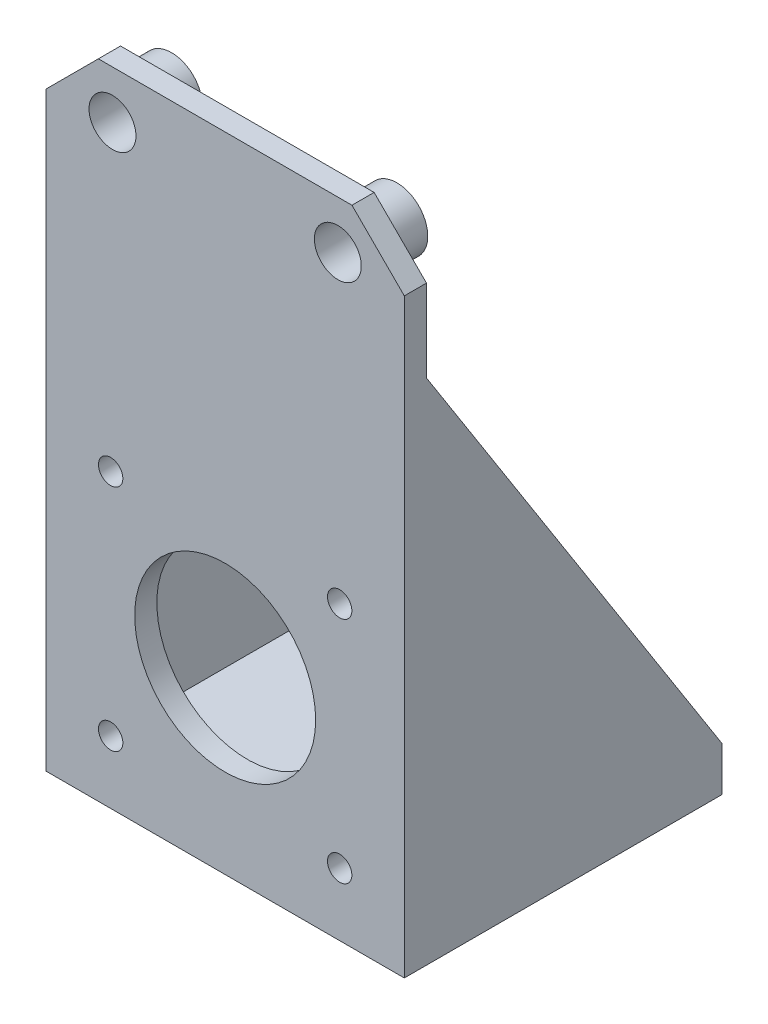
ISO-10303-21;
HEADER;
FILE_DESCRIPTION(('STEP AP214'),'2;1');
FILE_NAME('part.step','',(''),(''),'','','');
FILE_SCHEMA(('AUTOMOTIVE_DESIGN { 1 0 10303 214 1 1 1 1 }'));
ENDSEC;
DATA;
#1=APPLICATION_CONTEXT('core data for automotive mechanical design processes');
#2=APPLICATION_PROTOCOL_DEFINITION('international standard','automotive_design',2000,#1);
#3=PRODUCT_CONTEXT('',#1,'mechanical');
#4=PRODUCT('Part','Part','',(#3));
#5=PRODUCT_RELATED_PRODUCT_CATEGORY('part','',(#4));
#6=PRODUCT_DEFINITION_FORMATION('','',#4);
#7=PRODUCT_DEFINITION_CONTEXT('part definition',#1,'design');
#8=PRODUCT_DEFINITION('design','',#6,#7);
#9=PRODUCT_DEFINITION_SHAPE('','',#8);
#10=(LENGTH_UNIT() NAMED_UNIT(*) SI_UNIT(.MILLI.,.METRE.));
#11=(NAMED_UNIT(*) PLANE_ANGLE_UNIT() SI_UNIT($,.RADIAN.));
#12=(NAMED_UNIT(*) SI_UNIT($,.STERADIAN.) SOLID_ANGLE_UNIT());
#13=UNCERTAINTY_MEASURE_WITH_UNIT(LENGTH_MEASURE(1.E-05),#10,'distance_accuracy_value','');
#14=(GEOMETRIC_REPRESENTATION_CONTEXT(3) GLOBAL_UNCERTAINTY_ASSIGNED_CONTEXT((#13)) GLOBAL_UNIT_ASSIGNED_CONTEXT((#10,
#11,#12)) REPRESENTATION_CONTEXT('',''));
#15=CARTESIAN_POINT('',(0.,0.,0.));
#16=DIRECTION('',(0.,0.,1.));
#17=DIRECTION('',(1.,0.,0.));
#18=AXIS2_PLACEMENT_3D('',#15,#16,#17);
#19=CARTESIAN_POINT('',(0.,0.,0.));
#20=DIRECTION('',(0.,0.,-1.));
#21=DIRECTION('',(-1.,0.,0.));
#22=AXIS2_PLACEMENT_3D('',#19,#20,#21);
#23=PLANE('',#22);
#24=DIRECTION('',(-0.707106781186546,0.707106781186549,0.));
#25=VECTOR('',#24,1.);
#26=CARTESIAN_POINT('',(41.3209689512083,41.3209689512082,0.));
#27=LINE('',#26,#25);
#28=CARTESIAN_POINT('',(11.6777243400436,70.9642135623731,0.));
#29=VERTEX_POINT('',#28);
#30=CARTESIAN_POINT('',(4.59193790241667,78.05,0.));
#31=VERTEX_POINT('',#30);
#32=EDGE_CURVE('E154',#29,#31,#27,.T.);
#33=ORIENTED_EDGE('',*,*,#32,.F.);
#34=DIRECTION('',(0.,1.,0.));
#35=VECTOR('',#34,1.);
#36=CARTESIAN_POINT('',(11.6777243400436,-2.99999999999997,0.));
#37=LINE('',#36,#35);
#38=CARTESIAN_POINT('',(11.6777243400436,59.8372093023255,0.));
#39=VERTEX_POINT('',#38);
#40=EDGE_CURVE('E139',#39,#29,#37,.T.);
#41=ORIENTED_EDGE('',*,*,#40,.F.);
#42=DIRECTION('',(1.,0.,0.));
#43=VECTOR('',#42,1.);
#44=CARTESIAN_POINT('',(0.,59.8372093023256,0.));
#45=LINE('',#44,#43);
#46=CARTESIAN_POINT('',(8.67772434004357,59.8372093023255,0.));
#47=VERTEX_POINT('',#46);
#48=EDGE_CURVE('E149',#47,#39,#45,.T.);
#49=ORIENTED_EDGE('',*,*,#48,.F.);
#50=DIRECTION('',(0.,-1.,0.));
#51=VECTOR('',#50,1.);
#52=CARTESIAN_POINT('',(8.67772434004357,48.0313996107964,0.));
#53=LINE('',#52,#51);
#54=CARTESIAN_POINT('',(8.67772434004357,-6.00000000000001,0.));
#55=VERTEX_POINT('',#54);
#56=EDGE_CURVE('E71',#47,#55,#53,.T.);
#57=ORIENTED_EDGE('',*,*,#56,.T.);
#58=DIRECTION('',(1.,0.,0.));
#59=VECTOR('',#58,1.);
#60=CARTESIAN_POINT('',(8.67772434004357,-6.00000000000001,0.));
#61=LINE('',#60,#59);
#62=CARTESIAN_POINT('',(-33.8222756599564,-6.00000000000001,0.));
#63=VERTEX_POINT('',#62);
#64=EDGE_CURVE('E282',#63,#55,#61,.T.);
#65=ORIENTED_EDGE('',*,*,#64,.F.);
#66=DIRECTION('',(0.,-1.,0.));
#67=VECTOR('',#66,1.);
#68=CARTESIAN_POINT('',(-33.8222756599564,-6.00000000000001,0.));
#69=LINE('',#68,#67);
#70=CARTESIAN_POINT('',(-33.8222756599564,59.8372093023255,0.));
#71=VERTEX_POINT('',#70);
#72=EDGE_CURVE('E63',#71,#63,#69,.T.);
#73=ORIENTED_EDGE('',*,*,#72,.F.);
#74=DIRECTION('',(1.,0.,0.));
#75=VECTOR('',#74,1.);
#76=CARTESIAN_POINT('',(0.,59.8372093023256,0.));
#77=LINE('',#76,#75);
#78=CARTESIAN_POINT('',(-36.8222756599564,59.8372093023255,0.));
#79=VERTEX_POINT('',#78);
#80=EDGE_CURVE('E195',#79,#71,#77,.T.);
#81=ORIENTED_EDGE('',*,*,#80,.F.);
#82=DIRECTION('',(0.,-1.,0.));
#83=VECTOR('',#82,1.);
#84=CARTESIAN_POINT('',(-36.8222756599564,-3.00000000000002,0.));
#85=LINE('',#84,#83);
#86=CARTESIAN_POINT('',(-36.8222756599564,70.9642135623731,0.));
#87=VERTEX_POINT('',#86);
#88=EDGE_CURVE('E148',#87,#79,#85,.T.);
#89=ORIENTED_EDGE('',*,*,#88,.F.);
#90=DIRECTION('',(0.707106781186546,0.707106781186549,0.));
#91=VECTOR('',#90,1.);
#92=CARTESIAN_POINT('',(-53.8932446111648,53.8932446111646,0.));
#93=LINE('',#92,#91);
#94=CARTESIAN_POINT('',(-29.7364892223295,78.05,0.));
#95=VERTEX_POINT('',#94);
#96=EDGE_CURVE('E159',#87,#95,#93,.T.);
#97=ORIENTED_EDGE('',*,*,#96,.T.);
#98=DIRECTION('',(1.,0.,0.));
#99=VECTOR('',#98,1.);
#100=CARTESIAN_POINT('',(0.,78.05,0.));
#101=LINE('',#100,#99);
#102=EDGE_CURVE('E163',#95,#31,#101,.T.);
#103=ORIENTED_EDGE('',*,*,#102,.T.);
#104=EDGE_LOOP('',(#33,#41,#49,#57,#65,#73,#81,#89,#97,#103));
#105=FACE_BOUND('',#104,.T.);
#106=CARTESIAN_POINT('',(2.67772434004357,71.55,0.));
#107=DIRECTION('',(0.,0.,-1.));
#108=DIRECTION('',(-1.,0.,0.));
#109=AXIS2_PLACEMENT_3D('',#106,#107,#108);
#110=CIRCLE('',#109,4.175);
#111=CARTESIAN_POINT('',(-1.49727565995643,71.55,0.));
#112=VERTEX_POINT('',#111);
#113=EDGE_CURVE('E230',#112,#112,#110,.T.);
#114=ORIENTED_EDGE('',*,*,#113,.F.);
#115=EDGE_LOOP('',(#114));
#116=FACE_BOUND('',#115,.T.);
#117=CARTESIAN_POINT('',(-28.0722756599564,30.5,0.));
#118=DIRECTION('',(0.,0.,1.));
#119=DIRECTION('',(-1.,0.,0.));
#120=AXIS2_PLACEMENT_3D('',#117,#118,#119);
#121=CIRCLE('',#120,1.65);
#122=CARTESIAN_POINT('',(-29.7222756599564,30.5,0.));
#123=VERTEX_POINT('',#122);
#124=EDGE_CURVE('E250',#123,#123,#121,.T.);
#125=ORIENTED_EDGE('',*,*,#124,.T.);
#126=EDGE_LOOP('',(#125));
#127=FACE_BOUND('',#126,.T.);
#128=CARTESIAN_POINT('',(-28.0722756599569,-0.500000000000012,0.));
#129=DIRECTION('',(0.,0.,1.));
#130=DIRECTION('',(1.,0.,0.));
#131=AXIS2_PLACEMENT_3D('',#128,#129,#130);
#132=CIRCLE('',#131,1.65);
#133=CARTESIAN_POINT('',(-26.4222756599569,-0.500000000000012,0.));
#134=VERTEX_POINT('',#133);
#135=EDGE_CURVE('E266',#134,#134,#132,.T.);
#136=ORIENTED_EDGE('',*,*,#135,.T.);
#137=EDGE_LOOP('',(#136));
#138=FACE_BOUND('',#137,.T.);
#139=CARTESIAN_POINT('',(2.9277243400431,-0.500000000000007,0.));
#140=DIRECTION('',(0.,0.,1.));
#141=DIRECTION('',(-1.,0.,0.));
#142=AXIS2_PLACEMENT_3D('',#139,#140,#141);
#143=CIRCLE('',#142,1.65);
#144=CARTESIAN_POINT('',(1.2777243400431,-0.500000000000007,0.));
#145=VERTEX_POINT('',#144);
#146=EDGE_CURVE('E274',#145,#145,#143,.T.);
#147=ORIENTED_EDGE('',*,*,#146,.T.);
#148=EDGE_LOOP('',(#147));
#149=FACE_BOUND('',#148,.T.);
#150=CARTESIAN_POINT('',(2.92772434004357,30.5,0.));
#151=DIRECTION('',(0.,0.,1.));
#152=DIRECTION('',(1.,0.,0.));
#153=AXIS2_PLACEMENT_3D('',#150,#151,#152);
#154=CIRCLE('',#153,1.65);
#155=CARTESIAN_POINT('',(4.57772434004357,30.5,0.));
#156=VERTEX_POINT('',#155);
#157=EDGE_CURVE('E258',#156,#156,#154,.T.);
#158=ORIENTED_EDGE('',*,*,#157,.T.);
#159=EDGE_LOOP('',(#158));
#160=FACE_BOUND('',#159,.T.);
#161=CARTESIAN_POINT('',(-12.5722756599564,15.25,0.));
#162=DIRECTION('',(0.,0.,1.));
#163=DIRECTION('',(1.,0.,0.));
#164=AXIS2_PLACEMENT_3D('',#161,#162,#163);
#165=CIRCLE('',#164,12.25);
#166=CARTESIAN_POINT('',(-0.322275659956434,15.25,0.));
#167=VERTEX_POINT('',#166);
#168=EDGE_CURVE('E245',#167,#167,#165,.T.);
#169=ORIENTED_EDGE('',*,*,#168,.T.);
#170=EDGE_LOOP('',(#169));
#171=FACE_BOUND('',#170,.T.);
#172=CARTESIAN_POINT('',(-27.8222756599564,71.55,0.));
#173=DIRECTION('',(0.,0.,-1.));
#174=DIRECTION('',(-1.,0.,0.));
#175=AXIS2_PLACEMENT_3D('',#172,#173,#174);
#176=CIRCLE('',#175,4.175);
#177=CARTESIAN_POINT('',(-31.9972756599564,71.55,0.));
#178=VERTEX_POINT('',#177);
#179=EDGE_CURVE('E226',#178,#178,#176,.T.);
#180=ORIENTED_EDGE('',*,*,#179,.F.);
#181=EDGE_LOOP('',(#180));
#182=FACE_BOUND('',#181,.T.);
#183=ADVANCED_FACE('F45',(#105,#116,#127,#138,#149,#160,#171,#182),#23,.T.);
#184=CARTESIAN_POINT('',(-33.8222756599564,-6.00000000000001,3.));
#185=DIRECTION('',(1.,0.,0.));
#186=DIRECTION('',(0.,0.,-1.));
#187=AXIS2_PLACEMENT_3D('',#184,#185,#186);
#188=PLANE('',#187);
#189=ORIENTED_EDGE('',*,*,#72,.T.);
#190=DIRECTION('',(0.,0.,-1.));
#191=VECTOR('',#190,1.);
#192=CARTESIAN_POINT('',(-33.8222756599564,-6.00000000000001,3.));
#193=LINE('',#192,#191);
#194=CARTESIAN_POINT('',(-33.8222756599564,-6.00000000000001,-40.));
#195=VERTEX_POINT('',#194);
#196=EDGE_CURVE('E49',#63,#195,#193,.T.);
#197=ORIENTED_EDGE('',*,*,#196,.T.);
#198=DIRECTION('',(0.,-1.,0.));
#199=VECTOR('',#198,1.);
#200=CARTESIAN_POINT('',(-33.8222756599564,-6.00000000000001,-40.));
#201=LINE('',#200,#199);
#202=CARTESIAN_POINT('',(-33.8222756599564,-3.00000000000001,-40.));
#203=VERTEX_POINT('',#202);
#204=EDGE_CURVE('E292',#203,#195,#201,.T.);
#205=ORIENTED_EDGE('',*,*,#204,.F.);
#206=DIRECTION('',(0.,-0.843584345436487,-0.536996696576891));
#207=VECTOR('',#206,1.);
#208=CARTESIAN_POINT('',(-33.8222756599564,64.55,3.));
#209=LINE('',#208,#207);
#210=EDGE_CURVE('E192',#71,#203,#209,.T.);
#211=ORIENTED_EDGE('',*,*,#210,.F.);
#212=EDGE_LOOP('',(#189,#197,#205,#211));
#213=FACE_BOUND('',#212,.T.);
#214=ADVANCED_FACE('F47',(#213),#188,.T.);
#215=CARTESIAN_POINT('',(-36.8222756599564,-3.00000000000001,3.));
#216=DIRECTION('',(-1.,0.,0.));
#217=DIRECTION('',(0.,0.,1.));
#218=AXIS2_PLACEMENT_3D('',#215,#216,#217);
#219=PLANE('',#218);
#220=ORIENTED_EDGE('',*,*,#88,.T.);
#221=DIRECTION('',(0.,-0.843584345436487,-0.536996696576891));
#222=VECTOR('',#221,1.);
#223=CARTESIAN_POINT('',(-36.8222756599564,64.55,3.));
#224=LINE('',#223,#222);
#225=CARTESIAN_POINT('',(-36.8222756599564,-3.00000000000001,-40.));
#226=VERTEX_POINT('',#225);
#227=EDGE_CURVE('E185',#79,#226,#224,.T.);
#228=ORIENTED_EDGE('',*,*,#227,.T.);
#229=DIRECTION('',(0.,1.,0.));
#230=VECTOR('',#229,1.);
#231=CARTESIAN_POINT('',(-36.8222756599564,-3.00000000000001,-40.));
#232=LINE('',#231,#230);
#233=CARTESIAN_POINT('',(-36.8222756599564,-9.00000000000002,-40.));
#234=VERTEX_POINT('',#233);
#235=EDGE_CURVE('E315',#234,#226,#232,.T.);
#236=ORIENTED_EDGE('',*,*,#235,.F.);
#237=DIRECTION('',(0.,0.,-1.));
#238=VECTOR('',#237,1.);
#239=CARTESIAN_POINT('',(-36.8222756599564,-9.00000000000002,3.));
#240=LINE('',#239,#238);
#241=CARTESIAN_POINT('',(-36.8222756599564,-9.00000000000002,3.));
#242=VERTEX_POINT('',#241);
#243=EDGE_CURVE('E11',#242,#234,#240,.T.);
#244=ORIENTED_EDGE('',*,*,#243,.F.);
#245=DIRECTION('',(0.,1.,0.));
#246=VECTOR('',#245,1.);
#247=CARTESIAN_POINT('',(-36.8222756599564,-3.00000000000001,3.));
#248=LINE('',#247,#246);
#249=CARTESIAN_POINT('',(-36.8222756599564,70.9642135623731,3.));
#250=VERTEX_POINT('',#249);
#251=EDGE_CURVE('E329',#242,#250,#248,.T.);
#252=ORIENTED_EDGE('',*,*,#251,.T.);
#253=DIRECTION('',(0.,0.,1.));
#254=VECTOR('',#253,1.);
#255=CARTESIAN_POINT('',(-36.8222756599564,70.9642135623731,0.));
#256=LINE('',#255,#254);
#257=EDGE_CURVE('E181',#87,#250,#256,.T.);
#258=ORIENTED_EDGE('',*,*,#257,.F.);
#259=EDGE_LOOP('',(#220,#228,#236,#244,#252,#258));
#260=FACE_BOUND('',#259,.T.);
#261=ADVANCED_FACE('F349',(#260),#219,.T.);
#262=CARTESIAN_POINT('',(-36.8222756599564,-9.00000000000002,3.));
#263=DIRECTION('',(0.,-1.,0.));
#264=DIRECTION('',(0.,0.,-1.));
#265=AXIS2_PLACEMENT_3D('',#262,#263,#264);
#266=PLANE('',#265);
#267=ORIENTED_EDGE('',*,*,#243,.T.);
#268=DIRECTION('',(-1.,0.,0.));
#269=VECTOR('',#268,1.);
#270=CARTESIAN_POINT('',(11.6777243400436,-9.00000000000002,-40.));
#271=LINE('',#270,#269);
#272=CARTESIAN_POINT('',(11.6777243400436,-9.00000000000002,-40.));
#273=VERTEX_POINT('',#272);
#274=EDGE_CURVE('E312',#273,#234,#271,.T.);
#275=ORIENTED_EDGE('',*,*,#274,.F.);
#276=DIRECTION('',(0.,0.,-1.));
#277=VECTOR('',#276,1.);
#278=CARTESIAN_POINT('',(11.6777243400436,-9.00000000000002,3.));
#279=LINE('',#278,#277);
#280=CARTESIAN_POINT('',(11.6777243400436,-9.00000000000002,3.));
#281=VERTEX_POINT('',#280);
#282=EDGE_CURVE('E55',#281,#273,#279,.T.);
#283=ORIENTED_EDGE('',*,*,#282,.F.);
#284=DIRECTION('',(-1.,0.,0.));
#285=VECTOR('',#284,1.);
#286=CARTESIAN_POINT('',(11.6777243400436,-9.00000000000002,3.));
#287=LINE('',#286,#285);
#288=EDGE_CURVE('E326',#281,#242,#287,.T.);
#289=ORIENTED_EDGE('',*,*,#288,.T.);
#290=EDGE_LOOP('',(#267,#275,#283,#289));
#291=FACE_BOUND('',#290,.T.);
#292=ADVANCED_FACE('F362',(#291),#266,.T.);
#293=CARTESIAN_POINT('',(11.6777243400436,-3.00000000000002,3.));
#294=DIRECTION('',(1.,0.,0.));
#295=DIRECTION('',(0.,0.,-1.));
#296=AXIS2_PLACEMENT_3D('',#293,#294,#295);
#297=PLANE('',#296);
#298=DIRECTION('',(0.,0.843584345436487,0.536996696576891));
#299=VECTOR('',#298,1.);
#300=CARTESIAN_POINT('',(11.6777243400436,-3.00000000000002,-40.));
#301=LINE('',#300,#299);
#302=CARTESIAN_POINT('',(11.6777243400436,-3.00000000000002,-40.));
#303=VERTEX_POINT('',#302);
#304=EDGE_CURVE('E145',#303,#39,#301,.T.);
#305=ORIENTED_EDGE('',*,*,#304,.T.);
#306=ORIENTED_EDGE('',*,*,#40,.T.);
#307=DIRECTION('',(0.,0.,1.));
#308=VECTOR('',#307,1.);
#309=CARTESIAN_POINT('',(11.6777243400436,70.9642135623731,0.));
#310=LINE('',#309,#308);
#311=CARTESIAN_POINT('',(11.6777243400436,70.9642135623731,3.));
#312=VERTEX_POINT('',#311);
#313=EDGE_CURVE('E142',#29,#312,#310,.T.);
#314=ORIENTED_EDGE('',*,*,#313,.T.);
#315=DIRECTION('',(0.,-1.,0.));
#316=VECTOR('',#315,1.);
#317=CARTESIAN_POINT('',(11.6777243400436,-3.00000000000002,3.));
#318=LINE('',#317,#316);
#319=EDGE_CURVE('E323',#312,#281,#318,.T.);
#320=ORIENTED_EDGE('',*,*,#319,.T.);
#321=ORIENTED_EDGE('',*,*,#282,.T.);
#322=DIRECTION('',(0.,-1.,0.));
#323=VECTOR('',#322,1.);
#324=CARTESIAN_POINT('',(11.6777243400436,-3.00000000000002,-40.));
#325=LINE('',#324,#323);
#326=EDGE_CURVE('E308',#303,#273,#325,.T.);
#327=ORIENTED_EDGE('',*,*,#326,.F.);
#328=EDGE_LOOP('',(#305,#306,#314,#320,#321,#327));
#329=FACE_BOUND('',#328,.T.);
#330=ADVANCED_FACE('F141',(#329),#297,.T.);
#331=CARTESIAN_POINT('',(8.67772434004357,-6.00000000000001,3.));
#332=DIRECTION('',(-1.,0.,0.));
#333=DIRECTION('',(0.,0.,1.));
#334=AXIS2_PLACEMENT_3D('',#331,#332,#333);
#335=PLANE('',#334);
#336=DIRECTION('',(0.,0.,-1.));
#337=VECTOR('',#336,1.);
#338=CARTESIAN_POINT('',(8.67772434004357,-6.00000000000001,3.));
#339=LINE('',#338,#337);
#340=CARTESIAN_POINT('',(8.67772434004357,-6.00000000000001,-40.));
#341=VERTEX_POINT('',#340);
#342=EDGE_CURVE('E333',#55,#341,#339,.T.);
#343=ORIENTED_EDGE('',*,*,#342,.F.);
#344=ORIENTED_EDGE('',*,*,#56,.F.);
#345=DIRECTION('',(0.,0.843584345436487,0.536996696576891));
#346=VECTOR('',#345,1.);
#347=CARTESIAN_POINT('',(8.67772434004357,-3.00000000000002,-40.));
#348=LINE('',#347,#346);
#349=CARTESIAN_POINT('',(8.67772434004357,-3.00000000000002,-40.));
#350=VERTEX_POINT('',#349);
#351=EDGE_CURVE('E202',#350,#47,#348,.T.);
#352=ORIENTED_EDGE('',*,*,#351,.F.);
#353=DIRECTION('',(0.,1.,0.));
#354=VECTOR('',#353,1.);
#355=CARTESIAN_POINT('',(8.67772434004357,-6.00000000000001,-40.));
#356=LINE('',#355,#354);
#357=EDGE_CURVE('E300',#341,#350,#356,.T.);
#358=ORIENTED_EDGE('',*,*,#357,.F.);
#359=EDGE_LOOP('',(#343,#344,#352,#358));
#360=FACE_BOUND('',#359,.T.);
#361=ADVANCED_FACE('F355',(#360),#335,.T.);
#362=CARTESIAN_POINT('',(-33.8222756599564,-6.00000000000001,3.));
#363=DIRECTION('',(0.,1.,0.));
#364=DIRECTION('',(0.,0.,1.));
#365=AXIS2_PLACEMENT_3D('',#362,#363,#364);
#366=PLANE('',#365);
#367=ORIENTED_EDGE('',*,*,#64,.T.);
#368=ORIENTED_EDGE('',*,*,#342,.T.);
#369=DIRECTION('',(1.,0.,0.));
#370=VECTOR('',#369,1.);
#371=CARTESIAN_POINT('',(-33.8222756599564,-6.00000000000001,-40.));
#372=LINE('',#371,#370);
#373=EDGE_CURVE('E296',#195,#341,#372,.T.);
#374=ORIENTED_EDGE('',*,*,#373,.F.);
#375=ORIENTED_EDGE('',*,*,#196,.F.);
#376=EDGE_LOOP('',(#367,#368,#374,#375));
#377=FACE_BOUND('',#376,.T.);
#378=ADVANCED_FACE('F340',(#377),#366,.T.);
#379=CARTESIAN_POINT('',(0.,0.,3.));
#380=DIRECTION('',(0.,0.,1.));
#381=DIRECTION('',(1.,0.,0.));
#382=AXIS2_PLACEMENT_3D('',#379,#380,#381);
#383=PLANE('',#382);
#384=ORIENTED_EDGE('',*,*,#319,.F.);
#385=DIRECTION('',(-0.707106781186546,0.707106781186549,0.));
#386=VECTOR('',#385,1.);
#387=CARTESIAN_POINT('',(41.3209689512083,41.3209689512082,3.));
#388=LINE('',#387,#386);
#389=CARTESIAN_POINT('',(4.59193790241667,78.05,3.));
#390=VERTEX_POINT('',#389);
#391=EDGE_CURVE('E156',#312,#390,#388,.T.);
#392=ORIENTED_EDGE('',*,*,#391,.T.);
#393=DIRECTION('',(1.,0.,0.));
#394=VECTOR('',#393,1.);
#395=CARTESIAN_POINT('',(0.,78.05,3.));
#396=LINE('',#395,#394);
#397=CARTESIAN_POINT('',(-29.7364892223295,78.05,3.));
#398=VERTEX_POINT('',#397);
#399=EDGE_CURVE('E171',#398,#390,#396,.T.);
#400=ORIENTED_EDGE('',*,*,#399,.F.);
#401=DIRECTION('',(0.707106781186546,0.707106781186549,0.));
#402=VECTOR('',#401,1.);
#403=CARTESIAN_POINT('',(-53.8932446111648,53.8932446111646,3.));
#404=LINE('',#403,#402);
#405=EDGE_CURVE('E166',#250,#398,#404,.T.);
#406=ORIENTED_EDGE('',*,*,#405,.F.);
#407=ORIENTED_EDGE('',*,*,#251,.F.);
#408=ORIENTED_EDGE('',*,*,#288,.F.);
#409=EDGE_LOOP('',(#384,#392,#400,#406,#407,#408));
#410=FACE_BOUND('',#409,.T.);
#411=CARTESIAN_POINT('',(2.9277243400431,-0.500000000000007,3.));
#412=DIRECTION('',(0.,0.,1.));
#413=DIRECTION('',(-1.,0.,0.));
#414=AXIS2_PLACEMENT_3D('',#411,#412,#413);
#415=CIRCLE('',#414,1.65);
#416=CARTESIAN_POINT('',(1.2777243400431,-0.500000000000007,3.));
#417=VERTEX_POINT('',#416);
#418=EDGE_CURVE('E278',#417,#417,#415,.T.);
#419=ORIENTED_EDGE('',*,*,#418,.F.);
#420=EDGE_LOOP('',(#419));
#421=FACE_BOUND('',#420,.T.);
#422=CARTESIAN_POINT('',(-28.0722756599569,-0.500000000000012,3.));
#423=DIRECTION('',(0.,0.,1.));
#424=DIRECTION('',(1.,0.,0.));
#425=AXIS2_PLACEMENT_3D('',#422,#423,#424);
#426=CIRCLE('',#425,1.65);
#427=CARTESIAN_POINT('',(-26.4222756599569,-0.500000000000012,3.));
#428=VERTEX_POINT('',#427);
#429=EDGE_CURVE('E270',#428,#428,#426,.T.);
#430=ORIENTED_EDGE('',*,*,#429,.F.);
#431=EDGE_LOOP('',(#430));
#432=FACE_BOUND('',#431,.T.);
#433=CARTESIAN_POINT('',(2.92772434004357,30.5,3.));
#434=DIRECTION('',(0.,0.,1.));
#435=DIRECTION('',(1.,0.,0.));
#436=AXIS2_PLACEMENT_3D('',#433,#434,#435);
#437=CIRCLE('',#436,1.65);
#438=CARTESIAN_POINT('',(4.57772434004357,30.5,3.));
#439=VERTEX_POINT('',#438);
#440=EDGE_CURVE('E262',#439,#439,#437,.T.);
#441=ORIENTED_EDGE('',*,*,#440,.F.);
#442=EDGE_LOOP('',(#441));
#443=FACE_BOUND('',#442,.T.);
#444=CARTESIAN_POINT('',(-28.0722756599564,30.5,3.));
#445=DIRECTION('',(0.,0.,1.));
#446=DIRECTION('',(-1.,0.,0.));
#447=AXIS2_PLACEMENT_3D('',#444,#445,#446);
#448=CIRCLE('',#447,1.65);
#449=CARTESIAN_POINT('',(-29.7222756599564,30.5,3.));
#450=VERTEX_POINT('',#449);
#451=EDGE_CURVE('E254',#450,#450,#448,.T.);
#452=ORIENTED_EDGE('',*,*,#451,.F.);
#453=EDGE_LOOP('',(#452));
#454=FACE_BOUND('',#453,.T.);
#455=CARTESIAN_POINT('',(-12.5722756599564,15.25,3.));
#456=DIRECTION('',(0.,0.,1.));
#457=DIRECTION('',(1.,0.,0.));
#458=AXIS2_PLACEMENT_3D('',#455,#456,#457);
#459=CIRCLE('',#458,12.25);
#460=CARTESIAN_POINT('',(-0.322275659956434,15.25,3.));
#461=VERTEX_POINT('',#460);
#462=EDGE_CURVE('E246',#461,#461,#459,.T.);
#463=ORIENTED_EDGE('',*,*,#462,.F.);
#464=EDGE_LOOP('',(#463));
#465=FACE_BOUND('',#464,.T.);
#466=CARTESIAN_POINT('',(-27.8222756599564,71.55,3.));
#467=DIRECTION('',(0.,0.,1.));
#468=DIRECTION('',(1.,0.,0.));
#469=AXIS2_PLACEMENT_3D('',#466,#467,#468);
#470=CIRCLE('',#469,3.175);
#471=CARTESIAN_POINT('',(-24.6472756599564,71.55,3.));
#472=VERTEX_POINT('',#471);
#473=EDGE_CURVE('E241',#472,#472,#470,.T.);
#474=ORIENTED_EDGE('',*,*,#473,.F.);
#475=EDGE_LOOP('',(#474));
#476=FACE_BOUND('',#475,.T.);
#477=CARTESIAN_POINT('',(2.67772434004357,71.55,3.));
#478=DIRECTION('',(0.,0.,1.));
#479=DIRECTION('',(-1.,0.,0.));
#480=AXIS2_PLACEMENT_3D('',#477,#478,#479);
#481=CIRCLE('',#480,3.175);
#482=CARTESIAN_POINT('',(-0.49727565995643,71.55,3.));
#483=VERTEX_POINT('',#482);
#484=EDGE_CURVE('E237',#483,#483,#481,.T.);
#485=ORIENTED_EDGE('',*,*,#484,.F.);
#486=EDGE_LOOP('',(#485));
#487=FACE_BOUND('',#486,.T.);
#488=ADVANCED_FACE('F365',(#410,#421,#432,#443,#454,#465,#476,#487),#383,.T.);
#489=CARTESIAN_POINT('',(0.,0.,-40.));
#490=DIRECTION('',(0.,0.,1.));
#491=DIRECTION('',(1.,0.,0.));
#492=AXIS2_PLACEMENT_3D('',#489,#490,#491);
#493=PLANE('',#492);
#494=ORIENTED_EDGE('',*,*,#204,.T.);
#495=ORIENTED_EDGE('',*,*,#373,.T.);
#496=ORIENTED_EDGE('',*,*,#357,.T.);
#497=DIRECTION('',(1.,0.,0.));
#498=VECTOR('',#497,1.);
#499=CARTESIAN_POINT('',(8.67772434004357,-3.00000000000002,-40.));
#500=LINE('',#499,#498);
#501=EDGE_CURVE('E304',#350,#303,#500,.T.);
#502=ORIENTED_EDGE('',*,*,#501,.T.);
#503=ORIENTED_EDGE('',*,*,#326,.T.);
#504=ORIENTED_EDGE('',*,*,#274,.T.);
#505=ORIENTED_EDGE('',*,*,#235,.T.);
#506=DIRECTION('',(1.,0.,0.));
#507=VECTOR('',#506,1.);
#508=CARTESIAN_POINT('',(-33.8222756599564,-3.00000000000001,-40.));
#509=LINE('',#508,#507);
#510=EDGE_CURVE('E319',#226,#203,#509,.T.);
#511=ORIENTED_EDGE('',*,*,#510,.T.);
#512=EDGE_LOOP('',(#494,#495,#496,#502,#503,#504,#505,#511));
#513=FACE_BOUND('',#512,.T.);
#514=ADVANCED_FACE('F343',(#513),#493,.F.);
#515=CARTESIAN_POINT('',(2.9277243400431,-0.500000000000007,3.));
#516=DIRECTION('',(0.,0.,-1.));
#517=DIRECTION('',(-1.,0.,0.));
#518=AXIS2_PLACEMENT_3D('',#515,#516,#517);
#519=CYLINDRICAL_SURFACE('',#518,1.65);
#520=ORIENTED_EDGE('',*,*,#418,.T.);
#521=EDGE_LOOP('',(#520));
#522=FACE_BOUND('',#521,.T.);
#523=ORIENTED_EDGE('',*,*,#146,.F.);
#524=EDGE_LOOP('',(#523));
#525=FACE_BOUND('',#524,.T.);
#526=ADVANCED_FACE('F388',(#522,#525),#519,.F.);
#527=CARTESIAN_POINT('',(-28.0722756599569,-0.500000000000012,3.));
#528=DIRECTION('',(0.,0.,-1.));
#529=DIRECTION('',(-1.,0.,0.));
#530=AXIS2_PLACEMENT_3D('',#527,#528,#529);
#531=CYLINDRICAL_SURFACE('',#530,1.65);
#532=ORIENTED_EDGE('',*,*,#429,.T.);
#533=EDGE_LOOP('',(#532));
#534=FACE_BOUND('',#533,.T.);
#535=ORIENTED_EDGE('',*,*,#135,.F.);
#536=EDGE_LOOP('',(#535));
#537=FACE_BOUND('',#536,.T.);
#538=ADVANCED_FACE('F424',(#534,#537),#531,.F.);
#539=CARTESIAN_POINT('',(2.92772434004357,30.5,3.));
#540=DIRECTION('',(0.,0.,-1.));
#541=DIRECTION('',(-1.,0.,0.));
#542=AXIS2_PLACEMENT_3D('',#539,#540,#541);
#543=CYLINDRICAL_SURFACE('',#542,1.65);
#544=ORIENTED_EDGE('',*,*,#440,.T.);
#545=EDGE_LOOP('',(#544));
#546=FACE_BOUND('',#545,.T.);
#547=ORIENTED_EDGE('',*,*,#157,.F.);
#548=EDGE_LOOP('',(#547));
#549=FACE_BOUND('',#548,.T.);
#550=ADVANCED_FACE('F431',(#546,#549),#543,.F.);
#551=CARTESIAN_POINT('',(-28.0722756599564,30.5,3.));
#552=DIRECTION('',(0.,0.,-1.));
#553=DIRECTION('',(-1.,0.,0.));
#554=AXIS2_PLACEMENT_3D('',#551,#552,#553);
#555=CYLINDRICAL_SURFACE('',#554,1.65);
#556=ORIENTED_EDGE('',*,*,#451,.T.);
#557=EDGE_LOOP('',(#556));
#558=FACE_BOUND('',#557,.T.);
#559=ORIENTED_EDGE('',*,*,#124,.F.);
#560=EDGE_LOOP('',(#559));
#561=FACE_BOUND('',#560,.T.);
#562=ADVANCED_FACE('F438',(#558,#561),#555,.F.);
#563=CARTESIAN_POINT('',(-12.5722756599564,15.25,3.));
#564=DIRECTION('',(0.,0.,-1.));
#565=DIRECTION('',(-1.,0.,0.));
#566=AXIS2_PLACEMENT_3D('',#563,#564,#565);
#567=CYLINDRICAL_SURFACE('',#566,12.25);
#568=ORIENTED_EDGE('',*,*,#462,.T.);
#569=EDGE_LOOP('',(#568));
#570=FACE_BOUND('',#569,.T.);
#571=ORIENTED_EDGE('',*,*,#168,.F.);
#572=EDGE_LOOP('',(#571));
#573=FACE_BOUND('',#572,.T.);
#574=ADVANCED_FACE('F446',(#570,#573),#567,.F.);
#575=CARTESIAN_POINT('',(-27.8222756599564,71.55,3.));
#576=DIRECTION('',(0.,0.,-1.));
#577=DIRECTION('',(-1.,0.,0.));
#578=AXIS2_PLACEMENT_3D('',#575,#576,#577);
#579=CYLINDRICAL_SURFACE('',#578,3.175);
#580=ORIENTED_EDGE('',*,*,#473,.T.);
#581=EDGE_LOOP('',(#580));
#582=FACE_BOUND('',#581,.T.);
#583=CARTESIAN_POINT('',(-27.8222756599564,71.55,-3.));
#584=DIRECTION('',(0.,0.,-1.));
#585=DIRECTION('',(-1.,0.,0.));
#586=AXIS2_PLACEMENT_3D('',#583,#584,#585);
#587=CIRCLE('',#586,3.175);
#588=CARTESIAN_POINT('',(-30.9972756599564,71.55,-3.));
#589=VERTEX_POINT('',#588);
#590=EDGE_CURVE('E217',#589,#589,#587,.T.);
#591=ORIENTED_EDGE('',*,*,#590,.T.);
#592=EDGE_LOOP('',(#591));
#593=FACE_BOUND('',#592,.T.);
#594=ADVANCED_FACE('F454',(#582,#593),#579,.F.);
#595=CARTESIAN_POINT('',(2.67772434004357,71.55,3.));
#596=DIRECTION('',(0.,0.,-1.));
#597=DIRECTION('',(-1.,0.,0.));
#598=AXIS2_PLACEMENT_3D('',#595,#596,#597);
#599=CYLINDRICAL_SURFACE('',#598,3.175);
#600=ORIENTED_EDGE('',*,*,#484,.T.);
#601=EDGE_LOOP('',(#600));
#602=FACE_BOUND('',#601,.T.);
#603=CARTESIAN_POINT('',(2.67772434004357,71.55,-3.));
#604=DIRECTION('',(0.,0.,-1.));
#605=DIRECTION('',(-1.,0.,0.));
#606=AXIS2_PLACEMENT_3D('',#603,#604,#605);
#607=CIRCLE('',#606,3.175);
#608=CARTESIAN_POINT('',(-0.49727565995643,71.55,-3.));
#609=VERTEX_POINT('',#608);
#610=EDGE_CURVE('E222',#609,#609,#607,.T.);
#611=ORIENTED_EDGE('',*,*,#610,.T.);
#612=EDGE_LOOP('',(#611));
#613=FACE_BOUND('',#612,.T.);
#614=ADVANCED_FACE('F462',(#602,#613),#599,.F.);
#615=CARTESIAN_POINT('',(2.67772434004357,71.55,-3.));
#616=DIRECTION('',(0.,0.,1.));
#617=DIRECTION('',(1.,0.,0.));
#618=AXIS2_PLACEMENT_3D('',#615,#616,#617);
#619=CYLINDRICAL_SURFACE('',#618,4.175);
#620=ORIENTED_EDGE('',*,*,#113,.T.);
#621=EDGE_LOOP('',(#620));
#622=FACE_BOUND('',#621,.T.);
#623=CARTESIAN_POINT('',(2.67772434004357,71.55,-5.));
#624=DIRECTION('',(0.,0.,-1.));
#625=DIRECTION('',(-1.,0.,0.));
#626=AXIS2_PLACEMENT_3D('',#623,#624,#625);
#627=CIRCLE('',#626,4.175);
#628=CARTESIAN_POINT('',(-1.49727565995643,71.55,-5.));
#629=VERTEX_POINT('',#628);
#630=EDGE_CURVE('E218',#629,#629,#627,.T.);
#631=ORIENTED_EDGE('',*,*,#630,.F.);
#632=EDGE_LOOP('',(#631));
#633=FACE_BOUND('',#632,.T.);
#634=ADVANCED_FACE('F470',(#622,#633),#619,.T.);
#635=CARTESIAN_POINT('',(-27.8222756599564,71.55,-3.));
#636=DIRECTION('',(0.,0.,1.));
#637=DIRECTION('',(1.,0.,0.));
#638=AXIS2_PLACEMENT_3D('',#635,#636,#637);
#639=CYLINDRICAL_SURFACE('',#638,4.175);
#640=ORIENTED_EDGE('',*,*,#179,.T.);
#641=EDGE_LOOP('',(#640));
#642=FACE_BOUND('',#641,.T.);
#643=CARTESIAN_POINT('',(-27.8222756599564,71.55,-5.));
#644=DIRECTION('',(0.,0.,-1.));
#645=DIRECTION('',(-1.,0.,0.));
#646=AXIS2_PLACEMENT_3D('',#643,#644,#645);
#647=CIRCLE('',#646,4.175);
#648=CARTESIAN_POINT('',(-31.9972756599564,71.55,-5.));
#649=VERTEX_POINT('',#648);
#650=EDGE_CURVE('E213',#649,#649,#647,.T.);
#651=ORIENTED_EDGE('',*,*,#650,.F.);
#652=EDGE_LOOP('',(#651));
#653=FACE_BOUND('',#652,.T.);
#654=ADVANCED_FACE('F478',(#642,#653),#639,.T.);
#655=CARTESIAN_POINT('',(2.67772434004357,71.55,-3.));
#656=DIRECTION('',(0.,0.,-1.));
#657=DIRECTION('',(-1.,0.,0.));
#658=AXIS2_PLACEMENT_3D('',#655,#656,#657);
#659=PLANE('',#658);
#660=ORIENTED_EDGE('',*,*,#610,.F.);
#661=EDGE_LOOP('',(#660));
#662=FACE_BOUND('',#661,.T.);
#663=ADVANCED_FACE('F486',(#662),#659,.F.);
#664=CARTESIAN_POINT('',(2.67772434004357,71.55,-5.));
#665=DIRECTION('',(0.,0.,-1.));
#666=DIRECTION('',(-1.,0.,0.));
#667=AXIS2_PLACEMENT_3D('',#664,#665,#666);
#668=PLANE('',#667);
#669=ORIENTED_EDGE('',*,*,#630,.T.);
#670=EDGE_LOOP('',(#669));
#671=FACE_BOUND('',#670,.T.);
#672=ADVANCED_FACE('F494',(#671),#668,.T.);
#673=CARTESIAN_POINT('',(-27.8222756599564,71.55,-3.));
#674=DIRECTION('',(0.,0.,-1.));
#675=DIRECTION('',(-1.,0.,0.));
#676=AXIS2_PLACEMENT_3D('',#673,#674,#675);
#677=PLANE('',#676);
#678=ORIENTED_EDGE('',*,*,#590,.F.);
#679=EDGE_LOOP('',(#678));
#680=FACE_BOUND('',#679,.T.);
#681=ADVANCED_FACE('F502',(#680),#677,.F.);
#682=CARTESIAN_POINT('',(-27.8222756599564,71.55,-5.));
#683=DIRECTION('',(0.,0.,-1.));
#684=DIRECTION('',(-1.,0.,0.));
#685=AXIS2_PLACEMENT_3D('',#682,#683,#684);
#686=PLANE('',#685);
#687=ORIENTED_EDGE('',*,*,#650,.T.);
#688=EDGE_LOOP('',(#687));
#689=FACE_BOUND('',#688,.T.);
#690=ADVANCED_FACE('F510',(#689),#686,.T.);
#691=CARTESIAN_POINT('',(8.67772434004357,-3.00000000000002,-40.));
#692=DIRECTION('',(0.,0.536996696576891,-0.843584345436487));
#693=DIRECTION('',(0.,0.843584345436488,0.536996696576891));
#694=AXIS2_PLACEMENT_3D('',#691,#692,#693);
#695=PLANE('',#694);
#696=ORIENTED_EDGE('',*,*,#351,.T.);
#697=ORIENTED_EDGE('',*,*,#48,.T.);
#698=ORIENTED_EDGE('',*,*,#304,.F.);
#699=ORIENTED_EDGE('',*,*,#501,.F.);
#700=EDGE_LOOP('',(#696,#697,#698,#699));
#701=FACE_BOUND('',#700,.T.);
#702=ADVANCED_FACE('F518',(#701),#695,.T.);
#703=CARTESIAN_POINT('',(-33.8222756599564,64.55,3.));
#704=DIRECTION('',(0.,0.536996696576891,-0.843584345436487));
#705=DIRECTION('',(0.,0.843584345436488,0.536996696576891));
#706=AXIS2_PLACEMENT_3D('',#703,#704,#705);
#707=PLANE('',#706);
#708=ORIENTED_EDGE('',*,*,#227,.F.);
#709=ORIENTED_EDGE('',*,*,#80,.T.);
#710=ORIENTED_EDGE('',*,*,#210,.T.);
#711=ORIENTED_EDGE('',*,*,#510,.F.);
#712=EDGE_LOOP('',(#708,#709,#710,#711));
#713=FACE_BOUND('',#712,.T.);
#714=ADVANCED_FACE('F346',(#713),#707,.T.);
#715=CARTESIAN_POINT('',(-53.8932446111648,53.8932446111646,0.));
#716=DIRECTION('',(0.707106781186548,-0.707106781186546,0.));
#717=DIRECTION('',(0.707106781186546,0.707106781186549,0.));
#718=AXIS2_PLACEMENT_3D('',#715,#716,#717);
#719=PLANE('',#718);
#720=ORIENTED_EDGE('',*,*,#405,.T.);
#721=DIRECTION('',(0.,0.,1.));
#722=VECTOR('',#721,1.);
#723=CARTESIAN_POINT('',(-29.7364892223295,78.05,0.));
#724=LINE('',#723,#722);
#725=EDGE_CURVE('E186',#95,#398,#724,.T.);
#726=ORIENTED_EDGE('',*,*,#725,.F.);
#727=ORIENTED_EDGE('',*,*,#96,.F.);
#728=ORIENTED_EDGE('',*,*,#257,.T.);
#729=EDGE_LOOP('',(#720,#726,#727,#728));
#730=FACE_BOUND('',#729,.T.);
#731=ADVANCED_FACE('F370',(#730),#719,.F.);
#732=CARTESIAN_POINT('',(0.,78.05,0.));
#733=DIRECTION('',(0.,-1.,0.));
#734=DIRECTION('',(0.,0.,-1.));
#735=AXIS2_PLACEMENT_3D('',#732,#733,#734);
#736=PLANE('',#735);
#737=ORIENTED_EDGE('',*,*,#399,.T.);
#738=DIRECTION('',(0.,0.,1.));
#739=VECTOR('',#738,1.);
#740=CARTESIAN_POINT('',(4.59193790241667,78.05,0.));
#741=LINE('',#740,#739);
#742=EDGE_CURVE('E158',#31,#390,#741,.T.);
#743=ORIENTED_EDGE('',*,*,#742,.F.);
#744=ORIENTED_EDGE('',*,*,#102,.F.);
#745=ORIENTED_EDGE('',*,*,#725,.T.);
#746=EDGE_LOOP('',(#737,#743,#744,#745));
#747=FACE_BOUND('',#746,.T.);
#748=ADVANCED_FACE('F372',(#747),#736,.F.);
#749=CARTESIAN_POINT('',(41.3209689512083,41.3209689512082,0.));
#750=DIRECTION('',(0.707106781186548,0.707106781186546,0.));
#751=DIRECTION('',(-0.707106781186546,0.707106781186549,0.));
#752=AXIS2_PLACEMENT_3D('',#749,#750,#751);
#753=PLANE('',#752);
#754=ORIENTED_EDGE('',*,*,#391,.F.);
#755=ORIENTED_EDGE('',*,*,#313,.F.);
#756=ORIENTED_EDGE('',*,*,#32,.T.);
#757=ORIENTED_EDGE('',*,*,#742,.T.);
#758=EDGE_LOOP('',(#754,#755,#756,#757));
#759=FACE_BOUND('',#758,.T.);
#760=ADVANCED_FACE('F153',(#759),#753,.T.);
#761=CLOSED_SHELL('',(#183,#214,#261,#292,#330,#361,#378,#488,#514,#526,#538,#550,#562,#574,
#594,#614,#634,#654,#663,#672,#681,#690,#702,#714,#731,#748,#760));
#762=MANIFOLD_SOLID_BREP('B2',#761);
#763=ADVANCED_BREP_SHAPE_REPRESENTATION('',(#18,#762),#14);
#764=SHAPE_DEFINITION_REPRESENTATION(#9,#763);
ENDSEC;
END-ISO-10303-21;
